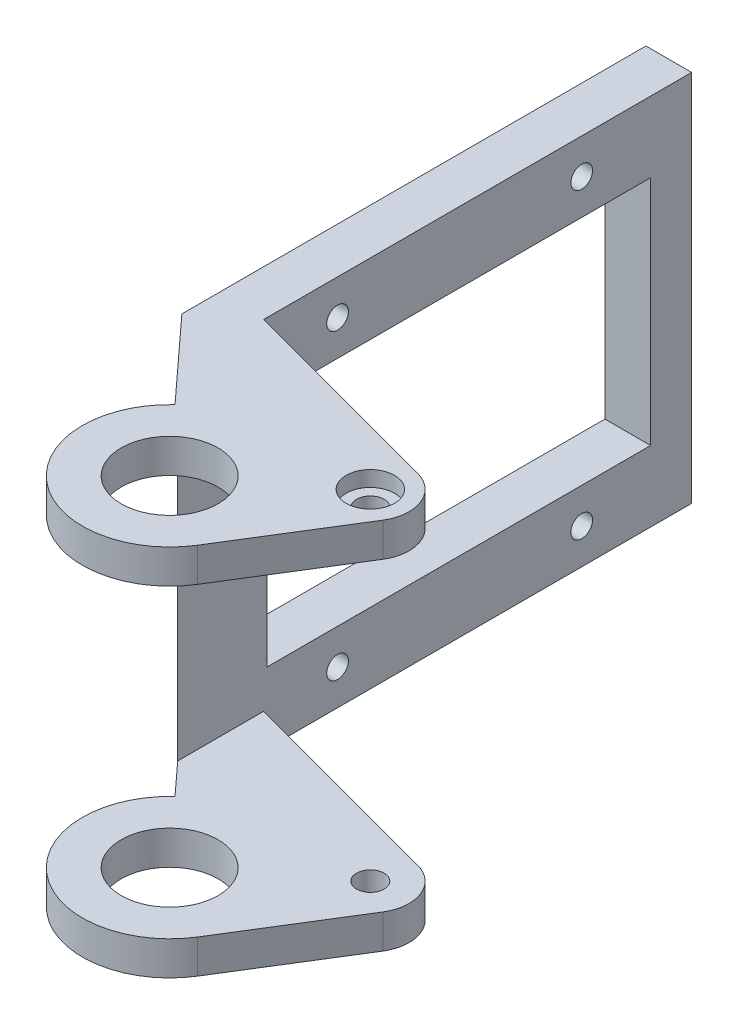
ISO-10303-21;
HEADER;
FILE_DESCRIPTION(('STEP AP214'),'2;1');
FILE_NAME('part.step','',(''),(''),'','','');
FILE_SCHEMA(('AUTOMOTIVE_DESIGN { 1 0 10303 214 1 1 1 1 }'));
ENDSEC;
DATA;
#1=APPLICATION_CONTEXT('core data for automotive mechanical design processes');
#2=APPLICATION_PROTOCOL_DEFINITION('international standard','automotive_design',2000,#1);
#3=PRODUCT_CONTEXT('',#1,'mechanical');
#4=PRODUCT('Part','Part','',(#3));
#5=PRODUCT_RELATED_PRODUCT_CATEGORY('part','',(#4));
#6=PRODUCT_DEFINITION_FORMATION('','',#4);
#7=PRODUCT_DEFINITION_CONTEXT('part definition',#1,'design');
#8=PRODUCT_DEFINITION('design','',#6,#7);
#9=PRODUCT_DEFINITION_SHAPE('','',#8);
#10=(LENGTH_UNIT() NAMED_UNIT(*) SI_UNIT(.MILLI.,.METRE.));
#11=(NAMED_UNIT(*) PLANE_ANGLE_UNIT() SI_UNIT($,.RADIAN.));
#12=(NAMED_UNIT(*) SI_UNIT($,.STERADIAN.) SOLID_ANGLE_UNIT());
#13=UNCERTAINTY_MEASURE_WITH_UNIT(LENGTH_MEASURE(1.E-05),#10,'distance_accuracy_value','');
#14=(GEOMETRIC_REPRESENTATION_CONTEXT(3) GLOBAL_UNCERTAINTY_ASSIGNED_CONTEXT((#13)) GLOBAL_UNIT_ASSIGNED_CONTEXT((#10,
#11,#12)) REPRESENTATION_CONTEXT('',''));
#15=CARTESIAN_POINT('',(0.,0.,0.));
#16=DIRECTION('',(0.,0.,1.));
#17=DIRECTION('',(1.,0.,0.));
#18=AXIS2_PLACEMENT_3D('',#15,#16,#17);
#19=CARTESIAN_POINT('',(9.17735510169387,12.508000003,-7.26238793210637));
#20=DIRECTION('',(0.,1.,0.));
#21=DIRECTION('',(0.,0.,1.));
#22=AXIS2_PLACEMENT_3D('',#19,#20,#21);
#23=CYLINDRICAL_SURFACE('',#22,1.1303);
#24=CARTESIAN_POINT('',(9.17735510169387,12.508000003,-7.26238793210637));
#25=DIRECTION('',(0.,1.,0.));
#26=DIRECTION('',(0.,0.,1.));
#27=AXIS2_PLACEMENT_3D('',#24,#25,#26);
#28=CIRCLE('',#27,1.1303);
#29=CARTESIAN_POINT('',(9.17735510169387,12.508000003,-6.13208793210637));
#30=VERTEX_POINT('',#29);
#31=EDGE_CURVE('E307',#30,#30,#28,.T.);
#32=ORIENTED_EDGE('',*,*,#31,.F.);
#33=EDGE_LOOP('',(#32));
#34=FACE_BOUND('',#33,.T.);
#35=CARTESIAN_POINT('',(9.17735510169387,14.016125003,-7.26238793210637));
#36=DIRECTION('',(0.,1.,0.));
#37=DIRECTION('',(0.,0.,1.));
#38=AXIS2_PLACEMENT_3D('',#35,#36,#37);
#39=CIRCLE('',#38,1.1303);
#40=CARTESIAN_POINT('',(9.17735510169387,14.016125003,-6.13208793210637));
#41=VERTEX_POINT('',#40);
#42=EDGE_CURVE('E38',#41,#41,#39,.F.);
#43=ORIENTED_EDGE('',*,*,#42,.F.);
#44=EDGE_LOOP('',(#43));
#45=FACE_BOUND('',#44,.T.);
#46=ADVANCED_FACE('F34',(#34,#45),#23,.F.);
#47=CARTESIAN_POINT('',(0.,15.286125003,0.));
#48=DIRECTION('',(0.,-1.,0.));
#49=DIRECTION('',(0.,0.,-1.));
#50=AXIS2_PLACEMENT_3D('',#47,#48,#49);
#51=CYLINDRICAL_SURFACE('',#50,7.14375);
#52=DIRECTION('',(0.,-1.,0.));
#53=VECTOR('',#52,1.);
#54=CARTESIAN_POINT('',(6.07003235918399,-12.508000003,3.76667907060839));
#55=LINE('',#54,#53);
#56=CARTESIAN_POINT('',(6.07003235918399,-12.508000003,3.76667907060839));
#57=VERTEX_POINT('',#56);
#58=CARTESIAN_POINT('',(6.07003235918399,-15.286125003,3.76667907060839));
#59=VERTEX_POINT('',#58);
#60=EDGE_CURVE('E311',#57,#59,#55,.T.);
#61=ORIENTED_EDGE('',*,*,#60,.F.);
#62=CARTESIAN_POINT('',(0.,-12.508000003,0.));
#63=DIRECTION('',(0.,-1.,0.));
#64=DIRECTION('',(1.,0.,0.));
#65=AXIS2_PLACEMENT_3D('',#62,#63,#64);
#66=CIRCLE('',#65,7.14375);
#67=CARTESIAN_POINT('',(-4.82624754565438,-12.508000003,-5.26692497483732));
#68=VERTEX_POINT('',#67);
#69=EDGE_CURVE('E244',#57,#68,#66,.T.);
#70=ORIENTED_EDGE('',*,*,#69,.T.);
#71=DIRECTION('',(0.,-1.,0.));
#72=VECTOR('',#71,1.);
#73=CARTESIAN_POINT('',(-4.82624754565438,15.286125003,-5.26692497483732));
#74=LINE('',#73,#72);
#75=CARTESIAN_POINT('',(-4.82624754565438,-15.286125003,-5.26692497483732));
#76=VERTEX_POINT('',#75);
#77=EDGE_CURVE('E227',#68,#76,#74,.T.);
#78=ORIENTED_EDGE('',*,*,#77,.T.);
#79=CARTESIAN_POINT('',(0.,-15.286125003,0.));
#80=DIRECTION('',(0.,1.,0.));
#81=DIRECTION('',(0.,0.,1.));
#82=AXIS2_PLACEMENT_3D('',#79,#80,#81);
#83=CIRCLE('',#82,7.14375);
#84=EDGE_CURVE('E223',#76,#59,#83,.T.);
#85=ORIENTED_EDGE('',*,*,#84,.T.);
#86=EDGE_LOOP('',(#61,#70,#78,#85));
#87=FACE_BOUND('',#86,.T.);
#88=ADVANCED_FACE('F411',(#87),#51,.T.);
#89=DIRECTION('',(0.,1.,0.));
#90=VECTOR('',#89,1.);
#91=CARTESIAN_POINT('',(6.07003235918399,12.508000003,3.76667907060839));
#92=LINE('',#91,#90);
#93=CARTESIAN_POINT('',(6.07003235918399,12.508000003,3.76667907060839));
#94=VERTEX_POINT('',#93);
#95=CARTESIAN_POINT('',(6.07003235918399,15.286125003,3.76667907060839));
#96=VERTEX_POINT('',#95);
#97=EDGE_CURVE('E317',#94,#96,#92,.T.);
#98=ORIENTED_EDGE('',*,*,#97,.T.);
#99=CARTESIAN_POINT('',(0.,15.286125003,0.));
#100=DIRECTION('',(0.,1.,0.));
#101=DIRECTION('',(0.,0.,1.));
#102=AXIS2_PLACEMENT_3D('',#99,#100,#101);
#103=CIRCLE('',#102,7.14375);
#104=CARTESIAN_POINT('',(-4.82624754565438,15.286125003,-5.26692497483732));
#105=VERTEX_POINT('',#104);
#106=EDGE_CURVE('E224',#105,#96,#103,.T.);
#107=ORIENTED_EDGE('',*,*,#106,.F.);
#108=CARTESIAN_POINT('',(-4.82624754565438,12.508000003,-5.26692497483732));
#109=VERTEX_POINT('',#108);
#110=EDGE_CURVE('E229',#105,#109,#74,.T.);
#111=ORIENTED_EDGE('',*,*,#110,.T.);
#112=CARTESIAN_POINT('',(0.,12.508000003,0.));
#113=DIRECTION('',(0.,1.,0.));
#114=DIRECTION('',(-1.,0.,0.));
#115=AXIS2_PLACEMENT_3D('',#112,#113,#114);
#116=CIRCLE('',#115,7.14375);
#117=EDGE_CURVE('E239',#109,#94,#116,.T.);
#118=ORIENTED_EDGE('',*,*,#117,.T.);
#119=EDGE_LOOP('',(#98,#107,#111,#118));
#120=FACE_BOUND('',#119,.T.);
#121=ADVANCED_FACE('F417',(#120),#51,.T.);
#122=CARTESIAN_POINT('',(18.4882738016951,0.,-37.6196247346275));
#123=DIRECTION('',(-0.737277336810123,0.,0.675590207615662));
#124=DIRECTION('',(0.675590207615662,0.,0.737277336810123));
#125=AXIS2_PLACEMENT_3D('',#122,#123,#124);
#126=CYLINDRICAL_SURFACE('',#125,0.535000000000002);
#127=CARTESIAN_POINT('',(-10.2997780692253,0.,-11.2402353660724));
#128=DIRECTION('',(-0.737277336810123,0.,0.675590207615662));
#129=DIRECTION('',(0.675590207615662,0.,0.737277336810123));
#130=AXIS2_PLACEMENT_3D('',#127,#128,#129);
#131=CIRCLE('',#130,0.535000000000002);
#132=CARTESIAN_POINT('',(-9.93833730815095,0.,-10.845791990879));
#133=VERTEX_POINT('',#132);
#134=EDGE_CURVE('E259',#133,#133,#131,.T.);
#135=ORIENTED_EDGE('',*,*,#134,.T.);
#136=EDGE_LOOP('',(#135));
#137=FACE_BOUND('',#136,.T.);
#138=CARTESIAN_POINT('',(-8.82522339560509,0.,-12.5914157813037));
#139=DIRECTION('',(0.737277336810123,0.,-0.675590207615662));
#140=DIRECTION('',(-0.675590207615662,0.,-0.737277336810123));
#141=AXIS2_PLACEMENT_3D('',#138,#139,#140);
#142=CIRCLE('',#141,0.535000000000002);
#143=CARTESIAN_POINT('',(-9.18666415667947,0.,-12.9858591564972));
#144=VERTEX_POINT('',#143);
#145=EDGE_CURVE('E252',#144,#144,#142,.F.);
#146=ORIENTED_EDGE('',*,*,#145,.F.);
#147=EDGE_LOOP('',(#146));
#148=FACE_BOUND('',#147,.T.);
#149=ADVANCED_FACE('F486',(#137,#148),#126,.F.);
#150=CARTESIAN_POINT('',(0.,15.286125003,0.));
#151=DIRECTION('',(0.737277336810123,0.,-0.675590207615662));
#152=DIRECTION('',(-0.675590207615662,0.,-0.737277336810123));
#153=AXIS2_PLACEMENT_3D('',#150,#151,#152);
#154=PLANE('',#153);
#155=ORIENTED_EDGE('',*,*,#134,.F.);
#156=EDGE_LOOP('',(#155));
#157=FACE_BOUND('',#156,.T.);
#158=DIRECTION('',(0.,1.,0.));
#159=VECTOR('',#158,1.);
#160=CARTESIAN_POINT('',(-10.984,15.286125003,-11.9869325757448));
#161=LINE('',#160,#159);
#162=CARTESIAN_POINT('',(-10.984,-15.286125003,-11.9869325757448));
#163=VERTEX_POINT('',#162);
#164=CARTESIAN_POINT('',(-10.984,15.286125003,-11.9869325757448));
#165=VERTEX_POINT('',#164);
#166=EDGE_CURVE('E374',#163,#165,#161,.T.);
#167=ORIENTED_EDGE('',*,*,#166,.F.);
#168=DIRECTION('',(0.675590207615662,0.,0.737277336810123));
#169=VECTOR('',#168,1.);
#170=CARTESIAN_POINT('',(0.,-15.286125003,0.));
#171=LINE('',#170,#169);
#172=EDGE_CURVE('E237',#163,#76,#171,.T.);
#173=ORIENTED_EDGE('',*,*,#172,.T.);
#174=ORIENTED_EDGE('',*,*,#77,.F.);
#175=DIRECTION('',(-0.675590207615662,0.,-0.737277336810123));
#176=VECTOR('',#175,1.);
#177=CARTESIAN_POINT('',(0.,-12.508000003,0.));
#178=LINE('',#177,#176);
#179=CARTESIAN_POINT('',(-7.23750000000001,-12.508000003,-7.89834527648883));
#180=VERTEX_POINT('',#179);
#181=EDGE_CURVE('E220',#68,#180,#178,.T.);
#182=ORIENTED_EDGE('',*,*,#181,.T.);
#183=DIRECTION('',(0.,1.,0.));
#184=VECTOR('',#183,1.);
#185=CARTESIAN_POINT('',(-7.2375,15.286125003,-7.89834527648883));
#186=LINE('',#185,#184);
#187=CARTESIAN_POINT('',(-7.23750000000001,12.508000003,-7.89834527648883));
#188=VERTEX_POINT('',#187);
#189=EDGE_CURVE('E189',#180,#188,#186,.T.);
#190=ORIENTED_EDGE('',*,*,#189,.T.);
#191=DIRECTION('',(0.675590207615662,0.,0.737277336810123));
#192=VECTOR('',#191,1.);
#193=CARTESIAN_POINT('',(0.,12.508000003,0.));
#194=LINE('',#193,#192);
#195=EDGE_CURVE('E190',#188,#109,#194,.T.);
#196=ORIENTED_EDGE('',*,*,#195,.T.);
#197=ORIENTED_EDGE('',*,*,#110,.F.);
#198=DIRECTION('',(0.675590207615662,0.,0.737277336810123));
#199=VECTOR('',#198,1.);
#200=CARTESIAN_POINT('',(0.,15.286125003,0.));
#201=LINE('',#200,#199);
#202=EDGE_CURVE('E236',#165,#105,#201,.T.);
#203=ORIENTED_EDGE('',*,*,#202,.F.);
#204=EDGE_LOOP('',(#167,#173,#174,#182,#190,#196,#197,#203));
#205=FACE_BOUND('',#204,.T.);
#206=ADVANCED_FACE('F489',(#157,#205),#154,.F.);
#207=CARTESIAN_POINT('',(-12.,15.286125003,-50.));
#208=DIRECTION('',(0.,0.,1.));
#209=DIRECTION('',(1.,0.,0.));
#210=AXIS2_PLACEMENT_3D('',#207,#208,#209);
#211=PLANE('',#210);
#212=DIRECTION('',(0.,-1.,0.));
#213=VECTOR('',#212,1.);
#214=CARTESIAN_POINT('',(-10.984,15.286125003,-50.));
#215=LINE('',#214,#213);
#216=CARTESIAN_POINT('',(-10.984,15.286125003,-50.));
#217=VERTEX_POINT('',#216);
#218=CARTESIAN_POINT('',(-10.984,-15.286125003,-50.));
#219=VERTEX_POINT('',#218);
#220=EDGE_CURVE('E372',#217,#219,#215,.T.);
#221=ORIENTED_EDGE('',*,*,#220,.F.);
#222=DIRECTION('',(-1.,0.,0.));
#223=VECTOR('',#222,1.);
#224=CARTESIAN_POINT('',(-12.,15.286125003,-50.));
#225=LINE('',#224,#223);
#226=CARTESIAN_POINT('',(-7.2375,15.286125003,-50.));
#227=VERTEX_POINT('',#226);
#228=EDGE_CURVE('E233',#227,#217,#225,.T.);
#229=ORIENTED_EDGE('',*,*,#228,.F.);
#230=DIRECTION('',(0.,1.,0.));
#231=VECTOR('',#230,1.);
#232=CARTESIAN_POINT('',(-7.23750000000001,12.508000003,-50.));
#233=LINE('',#232,#231);
#234=CARTESIAN_POINT('',(-7.2375,-15.286125003,-50.));
#235=VERTEX_POINT('',#234);
#236=EDGE_CURVE('E214',#235,#227,#233,.T.);
#237=ORIENTED_EDGE('',*,*,#236,.F.);
#238=DIRECTION('',(-1.,0.,0.));
#239=VECTOR('',#238,1.);
#240=CARTESIAN_POINT('',(-12.,-15.286125003,-50.));
#241=LINE('',#240,#239);
#242=EDGE_CURVE('E232',#235,#219,#241,.T.);
#243=ORIENTED_EDGE('',*,*,#242,.T.);
#244=EDGE_LOOP('',(#221,#229,#237,#243));
#245=FACE_BOUND('',#244,.T.);
#246=ADVANCED_FACE('F511',(#245),#211,.F.);
#247=CARTESIAN_POINT('',(0.,15.286125003,0.));
#248=DIRECTION('',(0.,-1.,0.));
#249=DIRECTION('',(0.,0.,-1.));
#250=AXIS2_PLACEMENT_3D('',#247,#248,#249);
#251=PLANE('',#250);
#252=CARTESIAN_POINT('',(9.17735510169387,15.286125003,-7.26238793210637));
#253=DIRECTION('',(0.,1.,0.));
#254=DIRECTION('',(0.,0.,1.));
#255=AXIS2_PLACEMENT_3D('',#252,#253,#254);
#256=CIRCLE('',#255,1.984375);
#257=CARTESIAN_POINT('',(9.17735510169387,15.286125003,-5.27801293210637));
#258=VERTEX_POINT('',#257);
#259=EDGE_CURVE('E398',#258,#258,#256,.T.);
#260=ORIENTED_EDGE('',*,*,#259,.F.);
#261=EDGE_LOOP('',(#260));
#262=FACE_BOUND('',#261,.T.);
#263=DIRECTION('',(0.52726916124002,0.,-0.849698317996009));
#264=VECTOR('',#263,1.);
#265=CARTESIAN_POINT('',(6.07003235918399,15.286125003,3.76667907060839));
#266=LINE('',#265,#264);
#267=CARTESIAN_POINT('',(11.8751472613312,15.286125003,-5.58830834516931));
#268=VERTEX_POINT('',#267);
#269=EDGE_CURVE('E298',#96,#268,#266,.T.);
#270=ORIENTED_EDGE('',*,*,#269,.T.);
#271=CARTESIAN_POINT('',(9.17735510169387,15.286125003,-7.26238793210637));
#272=DIRECTION('',(0.,-1.,0.));
#273=DIRECTION('',(0.,0.,-1.));
#274=AXIS2_PLACEMENT_3D('',#271,#272,#273);
#275=CIRCLE('',#274,3.175);
#276=CARTESIAN_POINT('',(9.99910556989436,15.286125003,-10.3292024305742));
#277=VERTEX_POINT('',#276);
#278=EDGE_CURVE('E57',#268,#277,#275,.F.);
#279=ORIENTED_EDGE('',*,*,#278,.T.);
#280=DIRECTION('',(-0.965925826289069,0.,-0.258819045102518));
#281=VECTOR('',#280,1.);
#282=CARTESIAN_POINT('',(-7.2375,15.286125003,-14.9477369732811));
#283=LINE('',#282,#281);
#284=CARTESIAN_POINT('',(-7.2375,15.286125003,-14.9477369732811));
#285=VERTEX_POINT('',#284);
#286=EDGE_CURVE('E306',#277,#285,#283,.T.);
#287=ORIENTED_EDGE('',*,*,#286,.T.);
#288=DIRECTION('',(0.,0.,1.));
#289=VECTOR('',#288,1.);
#290=CARTESIAN_POINT('',(-7.2375,15.286125003,-50.));
#291=LINE('',#290,#289);
#292=EDGE_CURVE('E206',#227,#285,#291,.T.);
#293=ORIENTED_EDGE('',*,*,#292,.F.);
#294=ORIENTED_EDGE('',*,*,#228,.T.);
#295=DIRECTION('',(0.,0.,-1.));
#296=VECTOR('',#295,1.);
#297=CARTESIAN_POINT('',(-10.984,15.286125003,0.));
#298=LINE('',#297,#296);
#299=EDGE_CURVE('E376',#165,#217,#298,.T.);
#300=ORIENTED_EDGE('',*,*,#299,.F.);
#301=ORIENTED_EDGE('',*,*,#202,.T.);
#302=ORIENTED_EDGE('',*,*,#106,.T.);
#303=EDGE_LOOP('',(#270,#279,#287,#293,#294,#300,#301,#302));
#304=FACE_BOUND('',#303,.T.);
#305=CARTESIAN_POINT('',(0.,15.286125003,0.));
#306=DIRECTION('',(0.,1.,0.));
#307=DIRECTION('',(0.,0.,1.));
#308=AXIS2_PLACEMENT_3D('',#305,#306,#307);
#309=CIRCLE('',#308,3.96875);
#310=CARTESIAN_POINT('',(0.,15.286125003,3.96875));
#311=VERTEX_POINT('',#310);
#312=EDGE_CURVE('E196',#311,#311,#309,.T.);
#313=ORIENTED_EDGE('',*,*,#312,.F.);
#314=EDGE_LOOP('',(#313));
#315=FACE_BOUND('',#314,.T.);
#316=ADVANCED_FACE('F303',(#262,#304,#315),#251,.F.);
#317=CARTESIAN_POINT('',(0.,-15.286125003,0.));
#318=DIRECTION('',(0.,-1.,0.));
#319=DIRECTION('',(0.,0.,-1.));
#320=AXIS2_PLACEMENT_3D('',#317,#318,#319);
#321=PLANE('',#320);
#322=DIRECTION('',(-0.965925826289069,0.,-0.258819045102518));
#323=VECTOR('',#322,1.);
#324=CARTESIAN_POINT('',(-7.2375,-15.286125003,-14.9477369732811));
#325=LINE('',#324,#323);
#326=CARTESIAN_POINT('',(9.99910556989436,-15.286125003,-10.3292024305742));
#327=VERTEX_POINT('',#326);
#328=CARTESIAN_POINT('',(-7.2375,-15.286125003,-14.9477369732811));
#329=VERTEX_POINT('',#328);
#330=EDGE_CURVE('E195',#327,#329,#325,.T.);
#331=ORIENTED_EDGE('',*,*,#330,.F.);
#332=CARTESIAN_POINT('',(9.17735510169387,-15.286125003,-7.26238793210637));
#333=DIRECTION('',(0.,-1.,0.));
#334=DIRECTION('',(0.,0.,-1.));
#335=AXIS2_PLACEMENT_3D('',#332,#333,#334);
#336=CIRCLE('',#335,3.175);
#337=CARTESIAN_POINT('',(11.8751472613312,-15.286125003,-5.58830834516931));
#338=VERTEX_POINT('',#337);
#339=EDGE_CURVE('E283',#327,#338,#336,.T.);
#340=ORIENTED_EDGE('',*,*,#339,.T.);
#341=DIRECTION('',(0.52726916124002,0.,-0.849698317996009));
#342=VECTOR('',#341,1.);
#343=CARTESIAN_POINT('',(6.07003235918399,-15.286125003,3.76667907060839));
#344=LINE('',#343,#342);
#345=EDGE_CURVE('E179',#59,#338,#344,.T.);
#346=ORIENTED_EDGE('',*,*,#345,.F.);
#347=ORIENTED_EDGE('',*,*,#84,.F.);
#348=ORIENTED_EDGE('',*,*,#172,.F.);
#349=DIRECTION('',(0.,0.,-1.));
#350=VECTOR('',#349,1.);
#351=CARTESIAN_POINT('',(-10.984,-15.286125003,0.));
#352=LINE('',#351,#350);
#353=EDGE_CURVE('E246',#163,#219,#352,.T.);
#354=ORIENTED_EDGE('',*,*,#353,.T.);
#355=ORIENTED_EDGE('',*,*,#242,.F.);
#356=DIRECTION('',(0.,0.,1.));
#357=VECTOR('',#356,1.);
#358=CARTESIAN_POINT('',(-7.2375,-15.286125003,-50.));
#359=LINE('',#358,#357);
#360=EDGE_CURVE('E203',#235,#329,#359,.T.);
#361=ORIENTED_EDGE('',*,*,#360,.T.);
#362=EDGE_LOOP('',(#331,#340,#346,#347,#348,#354,#355,#361));
#363=FACE_BOUND('',#362,.T.);
#364=CARTESIAN_POINT('',(9.17735510169387,-15.286125003,-7.26238793210637));
#365=DIRECTION('',(0.,1.,0.));
#366=DIRECTION('',(0.,0.,1.));
#367=AXIS2_PLACEMENT_3D('',#364,#365,#366);
#368=CIRCLE('',#367,1.1303);
#369=CARTESIAN_POINT('',(9.17735510169387,-15.286125003,-6.13208793210637));
#370=VERTEX_POINT('',#369);
#371=EDGE_CURVE('E393',#370,#370,#368,.T.);
#372=ORIENTED_EDGE('',*,*,#371,.T.);
#373=EDGE_LOOP('',(#372));
#374=FACE_BOUND('',#373,.T.);
#375=CARTESIAN_POINT('',(0.,-15.286125003,0.));
#376=DIRECTION('',(0.,1.,0.));
#377=DIRECTION('',(0.,0.,1.));
#378=AXIS2_PLACEMENT_3D('',#375,#376,#377);
#379=CIRCLE('',#378,3.96875);
#380=CARTESIAN_POINT('',(0.,-15.286125003,3.96875));
#381=VERTEX_POINT('',#380);
#382=EDGE_CURVE('E200',#381,#381,#379,.T.);
#383=ORIENTED_EDGE('',*,*,#382,.T.);
#384=EDGE_LOOP('',(#383));
#385=FACE_BOUND('',#384,.T.);
#386=ADVANCED_FACE('F506',(#363,#374,#385),#321,.T.);
#387=CARTESIAN_POINT('',(-7.23750000000001,12.508000003,7.14375));
#388=DIRECTION('',(-1.,0.,0.));
#389=DIRECTION('',(0.,-1.,0.));
#390=AXIS2_PLACEMENT_3D('',#387,#388,#389);
#391=PLANE('',#390);
#392=CARTESIAN_POINT('',(-7.23750000000001,12.3930625015,-40.9934662878724));
#393=DIRECTION('',(-1.,0.,0.));
#394=DIRECTION('',(0.,-1.,0.));
#395=AXIS2_PLACEMENT_3D('',#392,#393,#394);
#396=CIRCLE('',#395,0.888999999999997);
#397=CARTESIAN_POINT('',(-7.23750000000001,11.5040625015,-40.9934662878724));
#398=VERTEX_POINT('',#397);
#399=EDGE_CURVE('E277',#398,#398,#396,.T.);
#400=ORIENTED_EDGE('',*,*,#399,.T.);
#401=EDGE_LOOP('',(#400));
#402=FACE_BOUND('',#401,.T.);
#403=CARTESIAN_POINT('',(-7.23750000000001,12.3930625015,-20.9934662878724));
#404=DIRECTION('',(-1.,0.,0.));
#405=DIRECTION('',(0.,-1.,0.));
#406=AXIS2_PLACEMENT_3D('',#403,#404,#405);
#407=CIRCLE('',#406,0.888999999999997);
#408=CARTESIAN_POINT('',(-7.23750000000001,11.5040625015,-20.9934662878724));
#409=VERTEX_POINT('',#408);
#410=EDGE_CURVE('E272',#409,#409,#407,.T.);
#411=ORIENTED_EDGE('',*,*,#410,.T.);
#412=EDGE_LOOP('',(#411));
#413=FACE_BOUND('',#412,.T.);
#414=CARTESIAN_POINT('',(-7.23750000000001,-12.3930625015,-20.9934662878724));
#415=DIRECTION('',(-1.,0.,0.));
#416=DIRECTION('',(0.,-1.,0.));
#417=AXIS2_PLACEMENT_3D('',#414,#415,#416);
#418=CIRCLE('',#417,0.888999999999997);
#419=CARTESIAN_POINT('',(-7.23750000000001,-13.2820625015,-20.9934662878724));
#420=VERTEX_POINT('',#419);
#421=EDGE_CURVE('E267',#420,#420,#418,.T.);
#422=ORIENTED_EDGE('',*,*,#421,.T.);
#423=EDGE_LOOP('',(#422));
#424=FACE_BOUND('',#423,.T.);
#425=CARTESIAN_POINT('',(-7.23750000000001,-12.3930625015,-40.9934662878724));
#426=DIRECTION('',(-1.,0.,0.));
#427=DIRECTION('',(0.,-1.,0.));
#428=AXIS2_PLACEMENT_3D('',#425,#426,#427);
#429=CIRCLE('',#428,0.888999999999997);
#430=CARTESIAN_POINT('',(-7.23750000000001,-13.2820625015,-40.9934662878724));
#431=VERTEX_POINT('',#430);
#432=EDGE_CURVE('E262',#431,#431,#429,.T.);
#433=ORIENTED_EDGE('',*,*,#432,.T.);
#434=EDGE_LOOP('',(#433));
#435=FACE_BOUND('',#434,.T.);
#436=DIRECTION('',(0.,0.,-1.));
#437=VECTOR('',#436,1.);
#438=CARTESIAN_POINT('',(-7.23750000000001,-9.50000000000001,-15.2179446184681));
#439=LINE('',#438,#437);
#440=CARTESIAN_POINT('',(-7.23750000000001,-9.50000000000001,-15.2179446184681));
#441=VERTEX_POINT('',#440);
#442=CARTESIAN_POINT('',(-7.23750000000001,-9.50000000000001,-46.6399446184682));
#443=VERTEX_POINT('',#442);
#444=EDGE_CURVE('E340',#441,#443,#439,.T.);
#445=ORIENTED_EDGE('',*,*,#444,.F.);
#446=DIRECTION('',(0.,-1.,0.));
#447=VECTOR('',#446,1.);
#448=CARTESIAN_POINT('',(-7.23750000000001,-9.50000000000001,-15.2179446184681));
#449=LINE('',#448,#447);
#450=CARTESIAN_POINT('',(-7.23750000000001,-0.90349214906464,-15.2179446184681));
#451=VERTEX_POINT('',#450);
#452=EDGE_CURVE('E355',#451,#441,#449,.T.);
#453=ORIENTED_EDGE('',*,*,#452,.F.);
#454=CARTESIAN_POINT('',(-7.23750000000001,0.,-14.0462962244135));
#455=DIRECTION('',(-1.,0.,0.));
#456=DIRECTION('',(0.,0.,1.));
#457=AXIS2_PLACEMENT_3D('',#454,#455,#456);
#458=ELLIPSE('',#457,1.69542713113658,1.25);
#459=CARTESIAN_POINT('',(-7.23750000000001,0.903492149064639,-15.2179446184681));
#460=VERTEX_POINT('',#459);
#461=EDGE_CURVE('E255',#460,#451,#458,.F.);
#462=ORIENTED_EDGE('',*,*,#461,.F.);
#463=CARTESIAN_POINT('',(-7.23750000000001,9.49999999999999,-15.2179446184681));
#464=VERTEX_POINT('',#463);
#465=EDGE_CURVE('E356',#464,#460,#449,.T.);
#466=ORIENTED_EDGE('',*,*,#465,.F.);
#467=DIRECTION('',(0.,0.,1.));
#468=VECTOR('',#467,1.);
#469=CARTESIAN_POINT('',(-7.23750000000001,9.49999999999999,-15.2179446184681));
#470=LINE('',#469,#468);
#471=CARTESIAN_POINT('',(-7.23750000000001,9.49999999999999,-46.6399446184682));
#472=VERTEX_POINT('',#471);
#473=EDGE_CURVE('E352',#472,#464,#470,.T.);
#474=ORIENTED_EDGE('',*,*,#473,.F.);
#475=DIRECTION('',(0.,1.,0.));
#476=VECTOR('',#475,1.);
#477=CARTESIAN_POINT('',(-7.23750000000001,-9.50000000000001,-46.6399446184682));
#478=LINE('',#477,#476);
#479=EDGE_CURVE('E265',#443,#472,#478,.T.);
#480=ORIENTED_EDGE('',*,*,#479,.F.);
#481=EDGE_LOOP('',(#445,#453,#462,#466,#474,#480));
#482=FACE_BOUND('',#481,.T.);
#483=DIRECTION('',(0.,0.,-1.));
#484=VECTOR('',#483,1.);
#485=CARTESIAN_POINT('',(-7.23750000000001,-12.508000003,7.14375));
#486=LINE('',#485,#484);
#487=CARTESIAN_POINT('',(-7.2375,-12.508000003,-14.9477369732811));
#488=VERTEX_POINT('',#487);
#489=EDGE_CURVE('E170',#180,#488,#486,.T.);
#490=ORIENTED_EDGE('',*,*,#489,.T.);
#491=DIRECTION('',(0.,1.,0.));
#492=VECTOR('',#491,1.);
#493=CARTESIAN_POINT('',(-7.2375,-15.286125003,-14.9477369732811));
#494=LINE('',#493,#492);
#495=EDGE_CURVE('E185',#329,#488,#494,.T.);
#496=ORIENTED_EDGE('',*,*,#495,.F.);
#497=ORIENTED_EDGE('',*,*,#360,.F.);
#498=ORIENTED_EDGE('',*,*,#236,.T.);
#499=ORIENTED_EDGE('',*,*,#292,.T.);
#500=CARTESIAN_POINT('',(-7.23750000000001,12.508000003,-14.9477369732811));
#501=VERTEX_POINT('',#500);
#502=EDGE_CURVE('E197',#501,#285,#494,.T.);
#503=ORIENTED_EDGE('',*,*,#502,.F.);
#504=DIRECTION('',(0.,0.,-1.));
#505=VECTOR('',#504,1.);
#506=CARTESIAN_POINT('',(-7.23750000000001,12.508000003,7.14375));
#507=LINE('',#506,#505);
#508=EDGE_CURVE('E191',#188,#501,#507,.T.);
#509=ORIENTED_EDGE('',*,*,#508,.F.);
#510=ORIENTED_EDGE('',*,*,#189,.F.);
#511=EDGE_LOOP('',(#490,#496,#497,#498,#499,#503,#509,#510));
#512=FACE_BOUND('',#511,.T.);
#513=ADVANCED_FACE('F183',(#402,#413,#424,#435,#482,#512),#391,.F.);
#514=CARTESIAN_POINT('',(-7.23750000000001,-12.508000003,7.14375));
#515=DIRECTION('',(0.,-1.,0.));
#516=DIRECTION('',(1.,0.,0.));
#517=AXIS2_PLACEMENT_3D('',#514,#515,#516);
#518=PLANE('',#517);
#519=DIRECTION('',(0.52726916124002,0.,-0.849698317996009));
#520=VECTOR('',#519,1.);
#521=CARTESIAN_POINT('',(6.07003235918399,-12.508000003,3.76667907060839));
#522=LINE('',#521,#520);
#523=CARTESIAN_POINT('',(11.8751472613312,-12.508000003,-5.58830834516931));
#524=VERTEX_POINT('',#523);
#525=EDGE_CURVE('E178',#57,#524,#522,.T.);
#526=ORIENTED_EDGE('',*,*,#525,.T.);
#527=CARTESIAN_POINT('',(9.17735510169387,-12.508000003,-7.26238793210637));
#528=DIRECTION('',(0.,-1.,0.));
#529=DIRECTION('',(1.,0.,0.));
#530=AXIS2_PLACEMENT_3D('',#527,#528,#529);
#531=CIRCLE('',#530,3.175);
#532=CARTESIAN_POINT('',(9.99910556989436,-12.508000003,-10.3292024305742));
#533=VERTEX_POINT('',#532);
#534=EDGE_CURVE('E173',#524,#533,#531,.F.);
#535=ORIENTED_EDGE('',*,*,#534,.T.);
#536=DIRECTION('',(-0.965925826289069,0.,-0.258819045102518));
#537=VECTOR('',#536,1.);
#538=CARTESIAN_POINT('',(-7.2375,-12.508000003,-14.9477369732811));
#539=LINE('',#538,#537);
#540=EDGE_CURVE('E164',#533,#488,#539,.T.);
#541=ORIENTED_EDGE('',*,*,#540,.T.);
#542=ORIENTED_EDGE('',*,*,#489,.F.);
#543=ORIENTED_EDGE('',*,*,#181,.F.);
#544=ORIENTED_EDGE('',*,*,#69,.F.);
#545=EDGE_LOOP('',(#526,#535,#541,#542,#543,#544));
#546=FACE_BOUND('',#545,.T.);
#547=CARTESIAN_POINT('',(9.17735510169387,-12.508000003,-7.26238793210637));
#548=DIRECTION('',(0.,1.,0.));
#549=DIRECTION('',(0.,0.,1.));
#550=AXIS2_PLACEMENT_3D('',#547,#548,#549);
#551=CIRCLE('',#550,1.1303);
#552=CARTESIAN_POINT('',(9.17735510169387,-12.508000003,-6.13208793210637));
#553=VERTEX_POINT('',#552);
#554=EDGE_CURVE('E391',#553,#553,#551,.T.);
#555=ORIENTED_EDGE('',*,*,#554,.F.);
#556=EDGE_LOOP('',(#555));
#557=FACE_BOUND('',#556,.T.);
#558=CARTESIAN_POINT('',(0.,-12.508000003,0.));
#559=DIRECTION('',(0.,-1.,0.));
#560=DIRECTION('',(1.,0.,0.));
#561=AXIS2_PLACEMENT_3D('',#558,#559,#560);
#562=CIRCLE('',#561,3.96875);
#563=CARTESIAN_POINT('',(3.96875,-12.508000003,0.));
#564=VERTEX_POINT('',#563);
#565=EDGE_CURVE('E211',#564,#564,#562,.T.);
#566=ORIENTED_EDGE('',*,*,#565,.T.);
#567=EDGE_LOOP('',(#566));
#568=FACE_BOUND('',#567,.T.);
#569=ADVANCED_FACE('F167',(#546,#557,#568),#518,.F.);
#570=CARTESIAN_POINT('',(-7.23750000000001,12.508000003,7.14375));
#571=DIRECTION('',(0.,1.,0.));
#572=DIRECTION('',(-1.,0.,0.));
#573=AXIS2_PLACEMENT_3D('',#570,#571,#572);
#574=PLANE('',#573);
#575=CARTESIAN_POINT('',(0.,12.508000003,0.));
#576=DIRECTION('',(0.,1.,0.));
#577=DIRECTION('',(-1.,0.,0.));
#578=AXIS2_PLACEMENT_3D('',#575,#576,#577);
#579=CIRCLE('',#578,3.96875);
#580=CARTESIAN_POINT('',(-3.96875,12.508000003,0.));
#581=VERTEX_POINT('',#580);
#582=EDGE_CURVE('E209',#581,#581,#579,.T.);
#583=ORIENTED_EDGE('',*,*,#582,.T.);
#584=EDGE_LOOP('',(#583));
#585=FACE_BOUND('',#584,.T.);
#586=DIRECTION('',(-0.965925826289069,0.,-0.258819045102518));
#587=VECTOR('',#586,1.);
#588=CARTESIAN_POINT('',(-7.2375,12.508000003,-14.9477369732811));
#589=LINE('',#588,#587);
#590=CARTESIAN_POINT('',(9.99910556989436,12.508000003,-10.3292024305742));
#591=VERTEX_POINT('',#590);
#592=EDGE_CURVE('E314',#591,#501,#589,.T.);
#593=ORIENTED_EDGE('',*,*,#592,.F.);
#594=CARTESIAN_POINT('',(9.17735510169387,12.508000003,-7.26238793210637));
#595=DIRECTION('',(0.,1.,0.));
#596=DIRECTION('',(-1.,0.,0.));
#597=AXIS2_PLACEMENT_3D('',#594,#595,#596);
#598=CIRCLE('',#597,3.175);
#599=CARTESIAN_POINT('',(11.8751472613312,12.508000003,-5.58830834516931));
#600=VERTEX_POINT('',#599);
#601=EDGE_CURVE('E11',#591,#600,#598,.F.);
#602=ORIENTED_EDGE('',*,*,#601,.T.);
#603=DIRECTION('',(0.52726916124002,0.,-0.849698317996009));
#604=VECTOR('',#603,1.);
#605=CARTESIAN_POINT('',(6.07003235918399,12.508000003,3.76667907060839));
#606=LINE('',#605,#604);
#607=EDGE_CURVE('E300',#94,#600,#606,.T.);
#608=ORIENTED_EDGE('',*,*,#607,.F.);
#609=ORIENTED_EDGE('',*,*,#117,.F.);
#610=ORIENTED_EDGE('',*,*,#195,.F.);
#611=ORIENTED_EDGE('',*,*,#508,.T.);
#612=EDGE_LOOP('',(#593,#602,#608,#609,#610,#611));
#613=FACE_BOUND('',#612,.T.);
#614=ORIENTED_EDGE('',*,*,#31,.T.);
#615=EDGE_LOOP('',(#614));
#616=FACE_BOUND('',#615,.T.);
#617=ADVANCED_FACE('F501',(#585,#613,#616),#574,.F.);
#618=CARTESIAN_POINT('',(0.,-15.286125003,0.));
#619=DIRECTION('',(0.,1.,0.));
#620=DIRECTION('',(0.,0.,1.));
#621=AXIS2_PLACEMENT_3D('',#618,#619,#620);
#622=CYLINDRICAL_SURFACE('',#621,3.96875);
#623=ORIENTED_EDGE('',*,*,#312,.T.);
#624=EDGE_LOOP('',(#623));
#625=FACE_BOUND('',#624,.T.);
#626=ORIENTED_EDGE('',*,*,#582,.F.);
#627=EDGE_LOOP('',(#626));
#628=FACE_BOUND('',#627,.T.);
#629=ADVANCED_FACE('F497',(#625,#628),#622,.F.);
#630=ORIENTED_EDGE('',*,*,#382,.F.);
#631=EDGE_LOOP('',(#630));
#632=FACE_BOUND('',#631,.T.);
#633=ORIENTED_EDGE('',*,*,#565,.F.);
#634=EDGE_LOOP('',(#633));
#635=FACE_BOUND('',#634,.T.);
#636=ADVANCED_FACE('F493',(#632,#635),#622,.F.);
#637=CARTESIAN_POINT('',(-10.984,0.,0.));
#638=DIRECTION('',(-1.,0.,0.));
#639=DIRECTION('',(0.,0.,1.));
#640=AXIS2_PLACEMENT_3D('',#637,#638,#639);
#641=PLANE('',#640);
#642=CARTESIAN_POINT('',(-10.984,12.3930625015,-40.9934662878724));
#643=DIRECTION('',(-1.,0.,0.));
#644=DIRECTION('',(0.,0.,1.));
#645=AXIS2_PLACEMENT_3D('',#642,#643,#644);
#646=CIRCLE('',#645,2.55);
#647=CARTESIAN_POINT('',(-10.984,12.3930625015,-38.4434662878724));
#648=VERTEX_POINT('',#647);
#649=EDGE_CURVE('E319',#648,#648,#646,.T.);
#650=ORIENTED_EDGE('',*,*,#649,.F.);
#651=EDGE_LOOP('',(#650));
#652=FACE_BOUND('',#651,.T.);
#653=CARTESIAN_POINT('',(-10.984,12.3930625015,-20.9934662878724));
#654=DIRECTION('',(-1.,0.,0.));
#655=DIRECTION('',(0.,0.,1.));
#656=AXIS2_PLACEMENT_3D('',#653,#654,#655);
#657=CIRCLE('',#656,2.55);
#658=CARTESIAN_POINT('',(-10.984,12.3930625015,-18.4434662878724));
#659=VERTEX_POINT('',#658);
#660=EDGE_CURVE('E280',#659,#659,#657,.T.);
#661=ORIENTED_EDGE('',*,*,#660,.F.);
#662=EDGE_LOOP('',(#661));
#663=FACE_BOUND('',#662,.T.);
#664=CARTESIAN_POINT('',(-10.984,-12.3930625015,-20.9934662878724));
#665=DIRECTION('',(-1.,0.,0.));
#666=DIRECTION('',(0.,0.,1.));
#667=AXIS2_PLACEMENT_3D('',#664,#665,#666);
#668=CIRCLE('',#667,2.55);
#669=CARTESIAN_POINT('',(-10.984,-12.3930625015,-18.4434662878724));
#670=VERTEX_POINT('',#669);
#671=EDGE_CURVE('E275',#670,#670,#668,.T.);
#672=ORIENTED_EDGE('',*,*,#671,.F.);
#673=EDGE_LOOP('',(#672));
#674=FACE_BOUND('',#673,.T.);
#675=CARTESIAN_POINT('',(-10.984,-12.3930625015,-40.9934662878724));
#676=DIRECTION('',(-1.,0.,0.));
#677=DIRECTION('',(0.,0.,1.));
#678=AXIS2_PLACEMENT_3D('',#675,#676,#677);
#679=CIRCLE('',#678,2.55);
#680=CARTESIAN_POINT('',(-10.984,-12.3930625015,-38.4434662878724));
#681=VERTEX_POINT('',#680);
#682=EDGE_CURVE('E270',#681,#681,#679,.T.);
#683=ORIENTED_EDGE('',*,*,#682,.F.);
#684=EDGE_LOOP('',(#683));
#685=FACE_BOUND('',#684,.T.);
#686=DIRECTION('',(0.,1.,0.));
#687=VECTOR('',#686,1.);
#688=CARTESIAN_POINT('',(-10.984,-9.50000000000001,-46.6399446184682));
#689=LINE('',#688,#687);
#690=CARTESIAN_POINT('',(-10.984,-9.50000000000001,-46.6399446184682));
#691=VERTEX_POINT('',#690);
#692=CARTESIAN_POINT('',(-10.984,9.49999999999999,-46.6399446184682));
#693=VERTEX_POINT('',#692);
#694=EDGE_CURVE('E336',#691,#693,#689,.T.);
#695=ORIENTED_EDGE('',*,*,#694,.T.);
#696=DIRECTION('',(0.,0.,1.));
#697=VECTOR('',#696,1.);
#698=CARTESIAN_POINT('',(-10.984,9.49999999999999,-15.2179446184681));
#699=LINE('',#698,#697);
#700=CARTESIAN_POINT('',(-10.984,9.49999999999999,-15.2179446184681));
#701=VERTEX_POINT('',#700);
#702=EDGE_CURVE('E339',#693,#701,#699,.T.);
#703=ORIENTED_EDGE('',*,*,#702,.T.);
#704=DIRECTION('',(0.,-1.,0.));
#705=VECTOR('',#704,1.);
#706=CARTESIAN_POINT('',(-10.984,-9.50000000000001,-15.2179446184681));
#707=LINE('',#706,#705);
#708=CARTESIAN_POINT('',(-10.984,-9.50000000000001,-15.2179446184681));
#709=VERTEX_POINT('',#708);
#710=EDGE_CURVE('E343',#701,#709,#707,.T.);
#711=ORIENTED_EDGE('',*,*,#710,.T.);
#712=DIRECTION('',(0.,0.,-1.));
#713=VECTOR('',#712,1.);
#714=CARTESIAN_POINT('',(-10.984,-9.50000000000001,-15.2179446184681));
#715=LINE('',#714,#713);
#716=EDGE_CURVE('E346',#709,#691,#715,.T.);
#717=ORIENTED_EDGE('',*,*,#716,.T.);
#718=EDGE_LOOP('',(#695,#703,#711,#717));
#719=FACE_BOUND('',#718,.T.);
#720=ORIENTED_EDGE('',*,*,#299,.T.);
#721=ORIENTED_EDGE('',*,*,#220,.T.);
#722=ORIENTED_EDGE('',*,*,#353,.F.);
#723=ORIENTED_EDGE('',*,*,#166,.T.);
#724=EDGE_LOOP('',(#720,#721,#722,#723));
#725=FACE_BOUND('',#724,.T.);
#726=ADVANCED_FACE('F484',(#652,#663,#674,#685,#719,#725),#641,.T.);
#727=CARTESIAN_POINT('',(18.4882738016951,0.,-37.6196247346275));
#728=DIRECTION('',(-0.737277336810123,0.,0.675590207615662));
#729=DIRECTION('',(0.675590207615662,0.,0.737277336810123));
#730=AXIS2_PLACEMENT_3D('',#727,#728,#729);
#731=CYLINDRICAL_SURFACE('',#730,1.25);
#732=CARTESIAN_POINT('',(-5.95887014730399,0.,-15.2179446184681));
#733=DIRECTION('',(0.,0.,1.));
#734=DIRECTION('',(-1.,0.,0.));
#735=AXIS2_PLACEMENT_3D('',#732,#733,#734);
#736=ELLIPSE('',#735,1.85023404115282,1.25);
#737=EDGE_CURVE('E251',#460,#451,#736,.T.);
#738=ORIENTED_EDGE('',*,*,#737,.F.);
#739=ORIENTED_EDGE('',*,*,#461,.T.);
#740=EDGE_LOOP('',(#738,#739));
#741=FACE_BOUND('',#740,.T.);
#742=CARTESIAN_POINT('',(-8.82522339560509,0.,-12.5914157813037));
#743=DIRECTION('',(0.737277336810123,0.,-0.675590207615662));
#744=DIRECTION('',(-0.675590207615662,0.,-0.737277336810123));
#745=AXIS2_PLACEMENT_3D('',#742,#743,#744);
#746=CIRCLE('',#745,1.25);
#747=CARTESIAN_POINT('',(-9.66971115512467,0.,-13.5130124523164));
#748=VERTEX_POINT('',#747);
#749=EDGE_CURVE('E256',#748,#748,#746,.T.);
#750=ORIENTED_EDGE('',*,*,#749,.F.);
#751=EDGE_LOOP('',(#750));
#752=FACE_BOUND('',#751,.T.);
#753=ADVANCED_FACE('F480',(#741,#752),#731,.F.);
#754=CARTESIAN_POINT('',(-8.82522339560509,0.,-12.5914157813037));
#755=DIRECTION('',(0.737277336810123,0.,-0.675590207615662));
#756=DIRECTION('',(-0.675590207615662,0.,-0.737277336810123));
#757=AXIS2_PLACEMENT_3D('',#754,#755,#756);
#758=PLANE('',#757);
#759=ORIENTED_EDGE('',*,*,#749,.T.);
#760=EDGE_LOOP('',(#759));
#761=FACE_BOUND('',#760,.T.);
#762=ORIENTED_EDGE('',*,*,#145,.T.);
#763=EDGE_LOOP('',(#762));
#764=FACE_BOUND('',#763,.T.);
#765=ADVANCED_FACE('F476',(#761,#764),#758,.T.);
#766=CARTESIAN_POINT('',(-10.984,-9.50000000000001,-46.6399446184682));
#767=DIRECTION('',(0.,0.,-1.));
#768=DIRECTION('',(-1.,0.,0.));
#769=AXIS2_PLACEMENT_3D('',#766,#767,#768);
#770=PLANE('',#769);
#771=ORIENTED_EDGE('',*,*,#479,.T.);
#772=DIRECTION('',(1.,0.,0.));
#773=VECTOR('',#772,1.);
#774=CARTESIAN_POINT('',(-10.984,9.49999999999999,-46.6399446184682));
#775=LINE('',#774,#773);
#776=EDGE_CURVE('E349',#693,#472,#775,.T.);
#777=ORIENTED_EDGE('',*,*,#776,.F.);
#778=ORIENTED_EDGE('',*,*,#694,.F.);
#779=DIRECTION('',(1.,0.,0.));
#780=VECTOR('',#779,1.);
#781=CARTESIAN_POINT('',(-10.984,-9.50000000000001,-46.6399446184682));
#782=LINE('',#781,#780);
#783=EDGE_CURVE('E360',#691,#443,#782,.T.);
#784=ORIENTED_EDGE('',*,*,#783,.T.);
#785=EDGE_LOOP('',(#771,#777,#778,#784));
#786=FACE_BOUND('',#785,.T.);
#787=ADVANCED_FACE('F466',(#786),#770,.F.);
#788=CARTESIAN_POINT('',(-10.984,-9.50000000000001,-15.2179446184681));
#789=DIRECTION('',(0.,-1.,0.));
#790=DIRECTION('',(1.,0.,0.));
#791=AXIS2_PLACEMENT_3D('',#788,#789,#790);
#792=PLANE('',#791);
#793=ORIENTED_EDGE('',*,*,#444,.T.);
#794=ORIENTED_EDGE('',*,*,#783,.F.);
#795=ORIENTED_EDGE('',*,*,#716,.F.);
#796=DIRECTION('',(1.,0.,0.));
#797=VECTOR('',#796,1.);
#798=CARTESIAN_POINT('',(-10.984,-9.50000000000001,-15.2179446184681));
#799=LINE('',#798,#797);
#800=EDGE_CURVE('E362',#709,#441,#799,.T.);
#801=ORIENTED_EDGE('',*,*,#800,.T.);
#802=EDGE_LOOP('',(#793,#794,#795,#801));
#803=FACE_BOUND('',#802,.T.);
#804=ADVANCED_FACE('F462',(#803),#792,.F.);
#805=CARTESIAN_POINT('',(-10.984,-9.50000000000001,-15.2179446184681));
#806=DIRECTION('',(0.,0.,1.));
#807=DIRECTION('',(1.,0.,0.));
#808=AXIS2_PLACEMENT_3D('',#805,#806,#807);
#809=PLANE('',#808);
#810=ORIENTED_EDGE('',*,*,#737,.T.);
#811=ORIENTED_EDGE('',*,*,#452,.T.);
#812=ORIENTED_EDGE('',*,*,#800,.F.);
#813=ORIENTED_EDGE('',*,*,#710,.F.);
#814=DIRECTION('',(1.,0.,0.));
#815=VECTOR('',#814,1.);
#816=CARTESIAN_POINT('',(-10.984,9.49999999999999,-15.2179446184681));
#817=LINE('',#816,#815);
#818=EDGE_CURVE('E365',#701,#464,#817,.T.);
#819=ORIENTED_EDGE('',*,*,#818,.T.);
#820=ORIENTED_EDGE('',*,*,#465,.T.);
#821=EDGE_LOOP('',(#810,#811,#812,#813,#819,#820));
#822=FACE_BOUND('',#821,.T.);
#823=ADVANCED_FACE('F465',(#822),#809,.F.);
#824=CARTESIAN_POINT('',(-10.984,9.49999999999999,-15.2179446184681));
#825=DIRECTION('',(0.,1.,0.));
#826=DIRECTION('',(-1.,0.,0.));
#827=AXIS2_PLACEMENT_3D('',#824,#825,#826);
#828=PLANE('',#827);
#829=ORIENTED_EDGE('',*,*,#473,.T.);
#830=ORIENTED_EDGE('',*,*,#818,.F.);
#831=ORIENTED_EDGE('',*,*,#702,.F.);
#832=ORIENTED_EDGE('',*,*,#776,.T.);
#833=EDGE_LOOP('',(#829,#830,#831,#832));
#834=FACE_BOUND('',#833,.T.);
#835=ADVANCED_FACE('F460',(#834),#828,.F.);
#836=CARTESIAN_POINT('',(-10.984,-12.3930625015,-40.9934662878724));
#837=DIRECTION('',(-1.,0.,0.));
#838=DIRECTION('',(0.,0.,1.));
#839=AXIS2_PLACEMENT_3D('',#836,#837,#838);
#840=CYLINDRICAL_SURFACE('',#839,0.888999999999997);
#841=CARTESIAN_POINT('',(-9.07323807560591,-12.3930625015,-40.9934662878724));
#842=DIRECTION('',(-1.,0.,0.));
#843=DIRECTION('',(0.,0.,1.));
#844=AXIS2_PLACEMENT_3D('',#841,#842,#843);
#845=CIRCLE('',#844,0.888999999999997);
#846=CARTESIAN_POINT('',(-9.07323807560591,-12.3930625015,-40.1044662878724));
#847=VERTEX_POINT('',#846);
#848=EDGE_CURVE('E266',#847,#847,#845,.T.);
#849=ORIENTED_EDGE('',*,*,#848,.T.);
#850=EDGE_LOOP('',(#849));
#851=FACE_BOUND('',#850,.T.);
#852=ORIENTED_EDGE('',*,*,#432,.F.);
#853=EDGE_LOOP('',(#852));
#854=FACE_BOUND('',#853,.T.);
#855=ADVANCED_FACE('F456',(#851,#854),#840,.F.);
#856=CARTESIAN_POINT('',(-10.984,-12.3930625015,-40.9934662878724));
#857=DIRECTION('',(-1.,0.,0.));
#858=DIRECTION('',(0.,0.,1.));
#859=AXIS2_PLACEMENT_3D('',#856,#857,#858);
#860=CONICAL_SURFACE('',#859,2.55,0.715584993317676);
#861=ORIENTED_EDGE('',*,*,#848,.F.);
#862=EDGE_LOOP('',(#861));
#863=FACE_BOUND('',#862,.T.);
#864=ORIENTED_EDGE('',*,*,#682,.T.);
#865=EDGE_LOOP('',(#864));
#866=FACE_BOUND('',#865,.T.);
#867=ADVANCED_FACE('F452',(#863,#866),#860,.F.);
#868=CARTESIAN_POINT('',(-10.984,-12.3930625015,-20.9934662878724));
#869=DIRECTION('',(-1.,0.,0.));
#870=DIRECTION('',(0.,0.,1.));
#871=AXIS2_PLACEMENT_3D('',#868,#869,#870);
#872=CYLINDRICAL_SURFACE('',#871,0.888999999999997);
#873=CARTESIAN_POINT('',(-9.07323807560591,-12.3930625015,-20.9934662878724));
#874=DIRECTION('',(-1.,0.,0.));
#875=DIRECTION('',(0.,0.,1.));
#876=AXIS2_PLACEMENT_3D('',#873,#874,#875);
#877=CIRCLE('',#876,0.888999999999997);
#878=CARTESIAN_POINT('',(-9.07323807560591,-12.3930625015,-20.1044662878724));
#879=VERTEX_POINT('',#878);
#880=EDGE_CURVE('E271',#879,#879,#877,.T.);
#881=ORIENTED_EDGE('',*,*,#880,.T.);
#882=EDGE_LOOP('',(#881));
#883=FACE_BOUND('',#882,.T.);
#884=ORIENTED_EDGE('',*,*,#421,.F.);
#885=EDGE_LOOP('',(#884));
#886=FACE_BOUND('',#885,.T.);
#887=ADVANCED_FACE('F448',(#883,#886),#872,.F.);
#888=CARTESIAN_POINT('',(-10.984,-12.3930625015,-20.9934662878724));
#889=DIRECTION('',(-1.,0.,0.));
#890=DIRECTION('',(0.,0.,1.));
#891=AXIS2_PLACEMENT_3D('',#888,#889,#890);
#892=CONICAL_SURFACE('',#891,2.55,0.715584993317676);
#893=ORIENTED_EDGE('',*,*,#880,.F.);
#894=EDGE_LOOP('',(#893));
#895=FACE_BOUND('',#894,.T.);
#896=ORIENTED_EDGE('',*,*,#671,.T.);
#897=EDGE_LOOP('',(#896));
#898=FACE_BOUND('',#897,.T.);
#899=ADVANCED_FACE('F444',(#895,#898),#892,.F.);
#900=CARTESIAN_POINT('',(-10.984,12.3930625015,-20.9934662878724));
#901=DIRECTION('',(-1.,0.,0.));
#902=DIRECTION('',(0.,0.,1.));
#903=AXIS2_PLACEMENT_3D('',#900,#901,#902);
#904=CYLINDRICAL_SURFACE('',#903,0.888999999999997);
#905=CARTESIAN_POINT('',(-9.07323807560591,12.3930625015,-20.9934662878724));
#906=DIRECTION('',(-1.,0.,0.));
#907=DIRECTION('',(0.,0.,1.));
#908=AXIS2_PLACEMENT_3D('',#905,#906,#907);
#909=CIRCLE('',#908,0.888999999999997);
#910=CARTESIAN_POINT('',(-9.07323807560591,12.3930625015,-20.1044662878724));
#911=VERTEX_POINT('',#910);
#912=EDGE_CURVE('E276',#911,#911,#909,.T.);
#913=ORIENTED_EDGE('',*,*,#912,.T.);
#914=EDGE_LOOP('',(#913));
#915=FACE_BOUND('',#914,.T.);
#916=ORIENTED_EDGE('',*,*,#410,.F.);
#917=EDGE_LOOP('',(#916));
#918=FACE_BOUND('',#917,.T.);
#919=ADVANCED_FACE('F440',(#915,#918),#904,.F.);
#920=CARTESIAN_POINT('',(-10.984,12.3930625015,-20.9934662878724));
#921=DIRECTION('',(-1.,0.,0.));
#922=DIRECTION('',(0.,0.,1.));
#923=AXIS2_PLACEMENT_3D('',#920,#921,#922);
#924=CONICAL_SURFACE('',#923,2.55,0.715584993317676);
#925=ORIENTED_EDGE('',*,*,#912,.F.);
#926=EDGE_LOOP('',(#925));
#927=FACE_BOUND('',#926,.T.);
#928=ORIENTED_EDGE('',*,*,#660,.T.);
#929=EDGE_LOOP('',(#928));
#930=FACE_BOUND('',#929,.T.);
#931=ADVANCED_FACE('F436',(#927,#930),#924,.F.);
#932=CARTESIAN_POINT('',(-10.984,12.3930625015,-40.9934662878724));
#933=DIRECTION('',(-1.,0.,0.));
#934=DIRECTION('',(0.,0.,1.));
#935=AXIS2_PLACEMENT_3D('',#932,#933,#934);
#936=CYLINDRICAL_SURFACE('',#935,0.888999999999997);
#937=CARTESIAN_POINT('',(-9.07323807560591,12.3930625015,-40.9934662878724));
#938=DIRECTION('',(-1.,0.,0.));
#939=DIRECTION('',(0.,0.,1.));
#940=AXIS2_PLACEMENT_3D('',#937,#938,#939);
#941=CIRCLE('',#940,0.888999999999997);
#942=CARTESIAN_POINT('',(-9.07323807560591,12.3930625015,-40.1044662878724));
#943=VERTEX_POINT('',#942);
#944=EDGE_CURVE('E281',#943,#943,#941,.T.);
#945=ORIENTED_EDGE('',*,*,#944,.T.);
#946=EDGE_LOOP('',(#945));
#947=FACE_BOUND('',#946,.T.);
#948=ORIENTED_EDGE('',*,*,#399,.F.);
#949=EDGE_LOOP('',(#948));
#950=FACE_BOUND('',#949,.T.);
#951=ADVANCED_FACE('F432',(#947,#950),#936,.F.);
#952=CARTESIAN_POINT('',(-10.984,12.3930625015,-40.9934662878724));
#953=DIRECTION('',(-1.,0.,0.));
#954=DIRECTION('',(0.,0.,1.));
#955=AXIS2_PLACEMENT_3D('',#952,#953,#954);
#956=CONICAL_SURFACE('',#955,2.55,0.715584993317676);
#957=ORIENTED_EDGE('',*,*,#944,.F.);
#958=EDGE_LOOP('',(#957));
#959=FACE_BOUND('',#958,.T.);
#960=ORIENTED_EDGE('',*,*,#649,.T.);
#961=EDGE_LOOP('',(#960));
#962=FACE_BOUND('',#961,.T.);
#963=ADVANCED_FACE('F426',(#959,#962),#956,.F.);
#964=CARTESIAN_POINT('',(-7.2375,12.508000003,-14.9477369732811));
#965=DIRECTION('',(0.258819045102518,0.,-0.965925826289069));
#966=DIRECTION('',(-0.965925826289069,0.,-0.258819045102518));
#967=AXIS2_PLACEMENT_3D('',#964,#965,#966);
#968=PLANE('',#967);
#969=ORIENTED_EDGE('',*,*,#286,.F.);
#970=DIRECTION('',(0.,1.,0.));
#971=VECTOR('',#970,1.);
#972=CARTESIAN_POINT('',(9.99910556989436,12.508000003,-10.3292024305742));
#973=LINE('',#972,#971);
#974=EDGE_CURVE('E43',#277,#591,#973,.F.);
#975=ORIENTED_EDGE('',*,*,#974,.T.);
#976=ORIENTED_EDGE('',*,*,#592,.T.);
#977=ORIENTED_EDGE('',*,*,#502,.T.);
#978=EDGE_LOOP('',(#969,#975,#976,#977));
#979=FACE_BOUND('',#978,.T.);
#980=ADVANCED_FACE('F383',(#979),#968,.T.);
#981=CARTESIAN_POINT('',(6.07003235918399,12.508000003,3.76667907060839));
#982=DIRECTION('',(0.849698317996008,0.,0.52726916124002));
#983=DIRECTION('',(0.52726916124002,0.,-0.849698317996009));
#984=AXIS2_PLACEMENT_3D('',#981,#982,#983);
#985=PLANE('',#984);
#986=ORIENTED_EDGE('',*,*,#607,.T.);
#987=DIRECTION('',(0.,1.,0.));
#988=VECTOR('',#987,1.);
#989=CARTESIAN_POINT('',(11.8751472613312,12.508000003,-5.58830834516931));
#990=LINE('',#989,#988);
#991=EDGE_CURVE('E288',#600,#268,#990,.T.);
#992=ORIENTED_EDGE('',*,*,#991,.T.);
#993=ORIENTED_EDGE('',*,*,#269,.F.);
#994=ORIENTED_EDGE('',*,*,#97,.F.);
#995=EDGE_LOOP('',(#986,#992,#993,#994));
#996=FACE_BOUND('',#995,.T.);
#997=ADVANCED_FACE('F296',(#996),#985,.T.);
#998=CARTESIAN_POINT('',(6.07003235918399,-12.508000003,3.76667907060839));
#999=DIRECTION('',(-0.849698317996008,0.,-0.52726916124002));
#1000=DIRECTION('',(-0.52726916124002,0.,0.849698317996009));
#1001=AXIS2_PLACEMENT_3D('',#998,#999,#1000);
#1002=PLANE('',#1001);
#1003=ORIENTED_EDGE('',*,*,#345,.T.);
#1004=DIRECTION('',(0.,-1.,0.));
#1005=VECTOR('',#1004,1.);
#1006=CARTESIAN_POINT('',(11.8751472613312,-12.508000003,-5.58830834516931));
#1007=LINE('',#1006,#1005);
#1008=EDGE_CURVE('E285',#338,#524,#1007,.F.);
#1009=ORIENTED_EDGE('',*,*,#1008,.T.);
#1010=ORIENTED_EDGE('',*,*,#525,.F.);
#1011=ORIENTED_EDGE('',*,*,#60,.T.);
#1012=EDGE_LOOP('',(#1003,#1009,#1010,#1011));
#1013=FACE_BOUND('',#1012,.T.);
#1014=ADVANCED_FACE('F429',(#1013),#1002,.F.);
#1015=CARTESIAN_POINT('',(-7.2375,-12.508000003,-14.9477369732811));
#1016=DIRECTION('',(-0.258819045102518,0.,0.965925826289069));
#1017=DIRECTION('',(0.965925826289069,0.,0.258819045102518));
#1018=AXIS2_PLACEMENT_3D('',#1015,#1016,#1017);
#1019=PLANE('',#1018);
#1020=ORIENTED_EDGE('',*,*,#540,.F.);
#1021=DIRECTION('',(0.,-1.,0.));
#1022=VECTOR('',#1021,1.);
#1023=CARTESIAN_POINT('',(9.99910556989437,-12.508000003,-10.3292024305742));
#1024=LINE('',#1023,#1022);
#1025=EDGE_CURVE('E261',#533,#327,#1024,.T.);
#1026=ORIENTED_EDGE('',*,*,#1025,.T.);
#1027=ORIENTED_EDGE('',*,*,#330,.T.);
#1028=ORIENTED_EDGE('',*,*,#495,.T.);
#1029=EDGE_LOOP('',(#1020,#1026,#1027,#1028));
#1030=FACE_BOUND('',#1029,.T.);
#1031=ADVANCED_FACE('F193',(#1030),#1019,.F.);
#1032=CARTESIAN_POINT('',(9.17735510169387,-12.508000003,-7.26238793210637));
#1033=DIRECTION('',(0.,-1.,0.));
#1034=DIRECTION('',(0.,0.,-1.));
#1035=AXIS2_PLACEMENT_3D('',#1032,#1033,#1034);
#1036=CYLINDRICAL_SURFACE('',#1035,1.1303);
#1037=ORIENTED_EDGE('',*,*,#554,.T.);
#1038=EDGE_LOOP('',(#1037));
#1039=FACE_BOUND('',#1038,.T.);
#1040=ORIENTED_EDGE('',*,*,#371,.F.);
#1041=EDGE_LOOP('',(#1040));
#1042=FACE_BOUND('',#1041,.T.);
#1043=ADVANCED_FACE('F522',(#1039,#1042),#1036,.F.);
#1044=CARTESIAN_POINT('',(9.17735510169387,-12.508000003,-7.26238793210637));
#1045=DIRECTION('',(0.,-1.,0.));
#1046=DIRECTION('',(0.,0.,-1.));
#1047=AXIS2_PLACEMENT_3D('',#1044,#1045,#1046);
#1048=CYLINDRICAL_SURFACE('',#1047,3.175);
#1049=ORIENTED_EDGE('',*,*,#534,.F.);
#1050=ORIENTED_EDGE('',*,*,#1008,.F.);
#1051=ORIENTED_EDGE('',*,*,#339,.F.);
#1052=ORIENTED_EDGE('',*,*,#1025,.F.);
#1053=EDGE_LOOP('',(#1049,#1050,#1051,#1052));
#1054=FACE_BOUND('',#1053,.T.);
#1055=ADVANCED_FACE('F520',(#1054),#1048,.T.);
#1056=CARTESIAN_POINT('',(9.17735510169387,12.508000003,-7.26238793210637));
#1057=DIRECTION('',(0.,1.,0.));
#1058=DIRECTION('',(0.,0.,1.));
#1059=AXIS2_PLACEMENT_3D('',#1056,#1057,#1058);
#1060=CYLINDRICAL_SURFACE('',#1059,3.175);
#1061=ORIENTED_EDGE('',*,*,#601,.F.);
#1062=ORIENTED_EDGE('',*,*,#974,.F.);
#1063=ORIENTED_EDGE('',*,*,#278,.F.);
#1064=ORIENTED_EDGE('',*,*,#991,.F.);
#1065=EDGE_LOOP('',(#1061,#1062,#1063,#1064));
#1066=FACE_BOUND('',#1065,.T.);
#1067=ADVANCED_FACE('F36',(#1066),#1060,.T.);
#1068=CARTESIAN_POINT('',(9.17735510169387,14.016125003,-7.26238793210637));
#1069=DIRECTION('',(0.,1.,0.));
#1070=DIRECTION('',(0.,0.,1.));
#1071=AXIS2_PLACEMENT_3D('',#1068,#1069,#1070);
#1072=PLANE('',#1071);
#1073=CARTESIAN_POINT('',(9.17735510169387,14.016125003,-7.26238793210637));
#1074=DIRECTION('',(0.,1.,0.));
#1075=DIRECTION('',(0.,0.,1.));
#1076=AXIS2_PLACEMENT_3D('',#1073,#1074,#1075);
#1077=CIRCLE('',#1076,1.984375);
#1078=CARTESIAN_POINT('',(9.17735510169387,14.016125003,-5.27801293210637));
#1079=VERTEX_POINT('',#1078);
#1080=EDGE_CURVE('E401',#1079,#1079,#1077,.T.);
#1081=ORIENTED_EDGE('',*,*,#1080,.T.);
#1082=EDGE_LOOP('',(#1081));
#1083=FACE_BOUND('',#1082,.T.);
#1084=ORIENTED_EDGE('',*,*,#42,.T.);
#1085=EDGE_LOOP('',(#1084));
#1086=FACE_BOUND('',#1085,.T.);
#1087=ADVANCED_FACE('F408',(#1083,#1086),#1072,.T.);
#1088=CARTESIAN_POINT('',(9.17735510169387,14.016125003,-7.26238793210637));
#1089=DIRECTION('',(0.,1.,0.));
#1090=DIRECTION('',(0.,0.,1.));
#1091=AXIS2_PLACEMENT_3D('',#1088,#1089,#1090);
#1092=CYLINDRICAL_SURFACE('',#1091,1.984375);
#1093=ORIENTED_EDGE('',*,*,#1080,.F.);
#1094=EDGE_LOOP('',(#1093));
#1095=FACE_BOUND('',#1094,.T.);
#1096=ORIENTED_EDGE('',*,*,#259,.T.);
#1097=EDGE_LOOP('',(#1096));
#1098=FACE_BOUND('',#1097,.T.);
#1099=ADVANCED_FACE('F703',(#1095,#1098),#1092,.F.);
#1100=CLOSED_SHELL('',(#46,#88,#121,#149,#206,#246,#316,#386,#513,#569,#617,#629,#636,#726,#753,
#765,#787,#804,#823,#835,#855,#867,#887,#899,#919,#931,#951,#963,#980,#997,#1014,#1031,#1043,
#1055,#1067,#1087,#1099));
#1101=MANIFOLD_SOLID_BREP('B2',#1100);
#1102=ADVANCED_BREP_SHAPE_REPRESENTATION('',(#18,#1101),#14);
#1103=SHAPE_DEFINITION_REPRESENTATION(#9,#1102);
ENDSEC;
END-ISO-10303-21;
